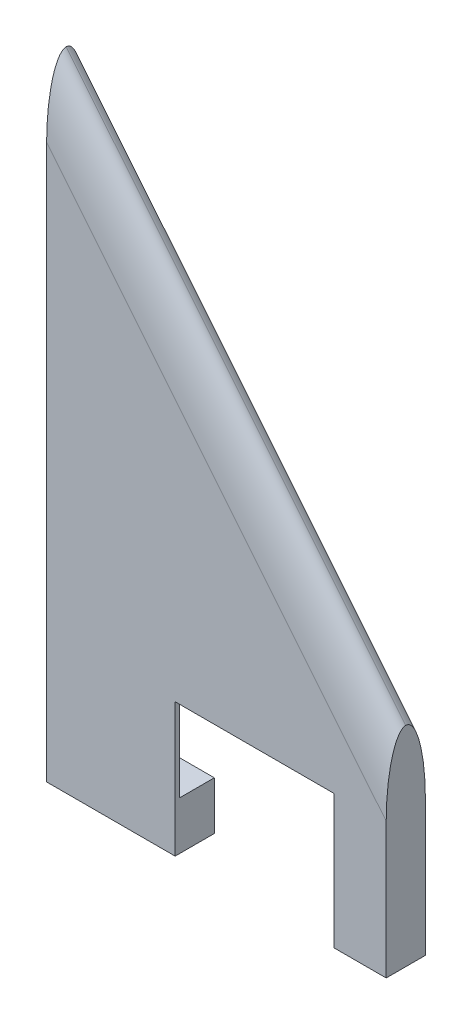
ISO-10303-21;
HEADER;
FILE_DESCRIPTION(('STEP AP214'),'2;1');
FILE_NAME('part.step','',(''),(''),'','','');
FILE_SCHEMA(('AUTOMOTIVE_DESIGN { 1 0 10303 214 1 1 1 1 }'));
ENDSEC;
DATA;
#1=APPLICATION_CONTEXT('core data for automotive mechanical design processes');
#2=APPLICATION_PROTOCOL_DEFINITION('international standard','automotive_design',2000,#1);
#3=PRODUCT_CONTEXT('',#1,'mechanical');
#4=PRODUCT('Part','Part','',(#3));
#5=PRODUCT_RELATED_PRODUCT_CATEGORY('part','',(#4));
#6=PRODUCT_DEFINITION_FORMATION('','',#4);
#7=PRODUCT_DEFINITION_CONTEXT('part definition',#1,'design');
#8=PRODUCT_DEFINITION('design','',#6,#7);
#9=PRODUCT_DEFINITION_SHAPE('','',#8);
#10=(LENGTH_UNIT() NAMED_UNIT(*) SI_UNIT(.MILLI.,.METRE.));
#11=(NAMED_UNIT(*) PLANE_ANGLE_UNIT() SI_UNIT($,.RADIAN.));
#12=(NAMED_UNIT(*) SI_UNIT($,.STERADIAN.) SOLID_ANGLE_UNIT());
#13=UNCERTAINTY_MEASURE_WITH_UNIT(LENGTH_MEASURE(1.E-05),#10,'distance_accuracy_value','');
#14=(GEOMETRIC_REPRESENTATION_CONTEXT(3) GLOBAL_UNCERTAINTY_ASSIGNED_CONTEXT((#13)) GLOBAL_UNIT_ASSIGNED_CONTEXT((#10,
#11,#12)) REPRESENTATION_CONTEXT('',''));
#15=CARTESIAN_POINT('',(0.,0.,0.));
#16=DIRECTION('',(0.,0.,1.));
#17=DIRECTION('',(1.,0.,0.));
#18=AXIS2_PLACEMENT_3D('',#15,#16,#17);
#19=CARTESIAN_POINT('',(0.,0.,-4.7625));
#20=DIRECTION('',(0.,0.,1.));
#21=DIRECTION('',(1.,0.,0.));
#22=AXIS2_PLACEMENT_3D('',#19,#20,#21);
#23=PLANE('',#22);
#24=DIRECTION('',(1.,0.,0.));
#25=VECTOR('',#24,1.);
#26=CARTESIAN_POINT('',(31.242,32.241499906,-4.7625));
#27=LINE('',#26,#25);
#28=CARTESIAN_POINT('',(17.0182560470692,32.241499906,-4.7625));
#29=VERTEX_POINT('',#28);
#30=CARTESIAN_POINT('',(31.242,32.241499906,-4.7625));
#31=VERTEX_POINT('',#30);
#32=EDGE_CURVE('E216',#29,#31,#27,.T.);
#33=ORIENTED_EDGE('',*,*,#32,.F.);
#34=CARTESIAN_POINT('',(17.0182560470692,35.416499906,-4.7625));
#35=DIRECTION('',(0.,0.,-1.));
#36=DIRECTION('',(-1.,0.,0.));
#37=AXIS2_PLACEMENT_3D('',#34,#35,#36);
#38=CIRCLE('',#37,3.175);
#39=CARTESIAN_POINT('',(14.7731920168019,33.1714358757327,-4.7625));
#40=VERTEX_POINT('',#39);
#41=EDGE_CURVE('E423',#29,#40,#38,.T.);
#42=ORIENTED_EDGE('',*,*,#41,.T.);
#43=DIRECTION('',(-0.707106781186546,0.707106781186549,0.));
#44=VECTOR('',#43,1.);
#45=CARTESIAN_POINT('',(14.7731920168019,33.1714358757327,-4.7625));
#46=LINE('',#45,#44);
#47=CARTESIAN_POINT('',(0.,47.9446278925346,-4.7625));
#48=VERTEX_POINT('',#47);
#49=EDGE_CURVE('E422',#40,#48,#46,.T.);
#50=ORIENTED_EDGE('',*,*,#49,.T.);
#51=DIRECTION('',(0.,-1.,0.));
#52=VECTOR('',#51,1.);
#53=CARTESIAN_POINT('',(0.,152.4,-4.7625));
#54=LINE('',#53,#52);
#55=CARTESIAN_POINT('',(0.,134.626096,-4.7625));
#56=VERTEX_POINT('',#55);
#57=EDGE_CURVE('E199',#56,#48,#54,.T.);
#58=ORIENTED_EDGE('',*,*,#57,.F.);
#59=CARTESIAN_POINT('',(84.143014050504,31.0654633224568,-4.7625));
#60=CARTESIAN_POINT('',(-1.59301405050503,136.586728677545,-4.7625));
#61=(BOUNDED_CURVE() B_SPLINE_CURVE(1,(#59,#60),.UNSPECIFIED.,.F.,
.F.) B_SPLINE_CURVE_WITH_KNOTS((2,2),(0.,1.),
.UNSPECIFIED.) CURVE() GEOMETRIC_REPRESENTATION_ITEM() RATIONAL_B_SPLINE_CURVE((1.,1.)) REPRESENTATION_ITEM(''));
#62=CARTESIAN_POINT('',(82.55,33.0260960000001,-4.7625));
#63=VERTEX_POINT('',#62);
#64=EDGE_CURVE('E334',#63,#56,#61,.T.);
#65=ORIENTED_EDGE('',*,*,#64,.F.);
#66=DIRECTION('',(0.,1.,0.));
#67=VECTOR('',#66,1.);
#68=CARTESIAN_POINT('',(82.55,0.,-4.7625));
#69=LINE('',#68,#67);
#70=CARTESIAN_POINT('',(82.55,0.,-4.7625));
#71=VERTEX_POINT('',#70);
#72=EDGE_CURVE('E368',#71,#63,#69,.T.);
#73=ORIENTED_EDGE('',*,*,#72,.F.);
#74=DIRECTION('',(1.,0.,0.));
#75=VECTOR('',#74,1.);
#76=CARTESIAN_POINT('',(0.,0.,-4.7625));
#77=LINE('',#76,#75);
#78=CARTESIAN_POINT('',(69.85,0.,-4.7625));
#79=VERTEX_POINT('',#78);
#80=EDGE_CURVE('E361',#79,#71,#77,.T.);
#81=ORIENTED_EDGE('',*,*,#80,.F.);
#82=DIRECTION('',(0.,1.,0.));
#83=VECTOR('',#82,1.);
#84=CARTESIAN_POINT('',(69.85,0.,-4.7625));
#85=LINE('',#84,#83);
#86=CARTESIAN_POINT('',(69.85,32.512,-4.7625));
#87=VERTEX_POINT('',#86);
#88=EDGE_CURVE('E70',#79,#87,#85,.T.);
#89=ORIENTED_EDGE('',*,*,#88,.T.);
#90=DIRECTION('',(-1.,0.,0.));
#91=VECTOR('',#90,1.);
#92=CARTESIAN_POINT('',(0.,32.512,-4.7625));
#93=LINE('',#92,#91);
#94=CARTESIAN_POINT('',(31.242,32.512,-4.7625));
#95=VERTEX_POINT('',#94);
#96=EDGE_CURVE('E259',#87,#95,#93,.T.);
#97=ORIENTED_EDGE('',*,*,#96,.T.);
#98=DIRECTION('',(0.,-1.,0.));
#99=VECTOR('',#98,1.);
#100=CARTESIAN_POINT('',(31.242,0.,-4.7625));
#101=LINE('',#100,#99);
#102=EDGE_CURVE('E258',#95,#31,#101,.T.);
#103=ORIENTED_EDGE('',*,*,#102,.T.);
#104=EDGE_LOOP('',(#33,#42,#50,#58,#65,#73,#81,#89,#97,#103));
#105=FACE_BOUND('',#104,.T.);
#106=ADVANCED_FACE('F45',(#105),#23,.F.);
#107=CARTESIAN_POINT('',(0.,0.,-4.7625));
#108=DIRECTION('',(0.,-1.,0.));
#109=DIRECTION('',(0.,0.,-1.));
#110=AXIS2_PLACEMENT_3D('',#107,#108,#109);
#111=PLANE('',#110);
#112=DIRECTION('',(0.,0.,-1.));
#113=VECTOR('',#112,1.);
#114=CARTESIAN_POINT('',(31.242,0.,-4.7625));
#115=LINE('',#114,#113);
#116=CARTESIAN_POINT('',(31.242,0.,4.7625));
#117=VERTEX_POINT('',#116);
#118=CARTESIAN_POINT('',(31.242,0.,-4.7625));
#119=VERTEX_POINT('',#118);
#120=EDGE_CURVE('E55',#117,#119,#115,.T.);
#121=ORIENTED_EDGE('',*,*,#120,.F.);
#122=DIRECTION('',(1.,0.,0.));
#123=VECTOR('',#122,1.);
#124=CARTESIAN_POINT('',(0.,0.,4.7625));
#125=LINE('',#124,#123);
#126=CARTESIAN_POINT('',(0.,0.,4.7625));
#127=VERTEX_POINT('',#126);
#128=EDGE_CURVE('E353',#127,#117,#125,.T.);
#129=ORIENTED_EDGE('',*,*,#128,.F.);
#130=DIRECTION('',(0.,0.,1.));
#131=VECTOR('',#130,1.);
#132=CARTESIAN_POINT('',(0.,0.,-4.7625));
#133=LINE('',#132,#131);
#134=CARTESIAN_POINT('',(0.,0.,-4.7625));
#135=VERTEX_POINT('',#134);
#136=EDGE_CURVE('E365',#135,#127,#133,.T.);
#137=ORIENTED_EDGE('',*,*,#136,.F.);
#138=EDGE_CURVE('E360',#135,#119,#77,.T.);
#139=ORIENTED_EDGE('',*,*,#138,.T.);
#140=EDGE_LOOP('',(#121,#129,#137,#139));
#141=FACE_BOUND('',#140,.T.);
#142=ADVANCED_FACE('F383',(#141),#111,.T.);
#143=CARTESIAN_POINT('',(0.,152.4,-4.7625));
#144=DIRECTION('',(-1.,0.,0.));
#145=DIRECTION('',(0.,-1.,0.));
#146=AXIS2_PLACEMENT_3D('',#143,#144,#145);
#147=PLANE('',#146);
#148=DIRECTION('',(0.,0.,1.));
#149=VECTOR('',#148,1.);
#150=CARTESIAN_POINT('',(0.,38.9643717714655,-4.7625));
#151=LINE('',#150,#149);
#152=CARTESIAN_POINT('',(0.,38.9643717714655,-4.7625));
#153=VERTEX_POINT('',#152);
#154=CARTESIAN_POINT('',(0.,38.9643717714654,3.753999985));
#155=VERTEX_POINT('',#154);
#156=EDGE_CURVE('E183',#153,#155,#151,.T.);
#157=ORIENTED_EDGE('',*,*,#156,.F.);
#158=EDGE_CURVE('E46',#153,#135,#54,.T.);
#159=ORIENTED_EDGE('',*,*,#158,.T.);
#160=ORIENTED_EDGE('',*,*,#136,.T.);
#161=DIRECTION('',(0.,-1.,0.));
#162=VECTOR('',#161,1.);
#163=CARTESIAN_POINT('',(0.,152.4,4.7625));
#164=LINE('',#163,#162);
#165=CARTESIAN_POINT('',(0.,134.626096,4.7625));
#166=VERTEX_POINT('',#165);
#167=EDGE_CURVE('E346',#166,#127,#164,.T.);
#168=ORIENTED_EDGE('',*,*,#167,.F.);
#169=CARTESIAN_POINT('',(0.,152.4,0.));
#170=CARTESIAN_POINT('',(0.,152.400035033636,0.0460353217043137));
#171=CARTESIAN_POINT('',(0.,152.397510348628,0.092048389848247));
#172=CARTESIAN_POINT('',(0.,152.387616574869,0.183456215200718));
#173=CARTESIAN_POINT('',(0.,152.380257716917,0.22885207200431));
#174=CARTESIAN_POINT('',(0.,152.361136052606,0.317870032808648));
#175=CARTESIAN_POINT('',(0.,152.349451962206,0.361509250159671));
#176=CARTESIAN_POINT('',(0.,152.322085738037,0.447528335791395));
#177=CARTESIAN_POINT('',(0.,152.30640143429,0.489907506563411));
#178=CARTESIAN_POINT('',(0.,152.267678441884,0.582292590972643));
#179=CARTESIAN_POINT('',(0.,152.243781467056,0.631938213996861));
#180=CARTESIAN_POINT('',(0.,152.191583767099,0.728835893407637));
#181=CARTESIAN_POINT('',(0.,152.163282003058,0.776087381621082));
#182=CARTESIAN_POINT('',(0.,152.072539822783,0.914832281977506));
#183=CARTESIAN_POINT('',(0.,152.004537830082,1.0027025118437));
#184=CARTESIAN_POINT('',(0.,151.865671174573,1.16156390178592));
#185=CARTESIAN_POINT('',(0.,151.79570046903,1.23336561679342));
#186=CARTESIAN_POINT('',(0.,151.649884699649,1.37082470305956));
#187=CARTESIAN_POINT('',(0.,151.574034462302,1.43647654815492));
#188=CARTESIAN_POINT('',(0.,151.417994237518,1.56251902023915));
#189=CARTESIAN_POINT('',(0.,151.337799606108,1.62290382962725));
#190=CARTESIAN_POINT('',(0.,151.174222677613,1.73908587819486));
#191=CARTESIAN_POINT('',(0.,151.090841638418,1.79488490083639));
#192=CARTESIAN_POINT('',(0.,150.916623207539,1.90571231906531));
#193=CARTESIAN_POINT('',(0.,150.825635461368,1.9605031242587));
#194=CARTESIAN_POINT('',(0.,150.641467893987,2.06628236222796));
#195=CARTESIAN_POINT('',(0.,150.548287661496,2.11727007399194));
#196=CARTESIAN_POINT('',(0.,150.265845275651,2.26543081603702));
#197=CARTESIAN_POINT('',(0.,150.073967478124,2.35762474998972));
#198=CARTESIAN_POINT('',(0.,149.685451589591,2.53166097585662));
#199=CARTESIAN_POINT('',(0.,149.488809350857,2.61349383161488));
#200=CARTESIAN_POINT('',(0.,149.091266225217,2.76902693224126));
#201=CARTESIAN_POINT('',(0.,148.890349437097,2.84268629146994));
#202=CARTESIAN_POINT('',(0.,148.486282253223,2.98274056381192));
#203=CARTESIAN_POINT('',(0.,148.283134748936,3.04914388365036));
#204=CARTESIAN_POINT('',(0.,147.875004215623,3.17579476160435));
#205=CARTESIAN_POINT('',(0.,147.670021728566,3.236044076066));
#206=CARTESIAN_POINT('',(0.,147.20654083781,3.36575403243569));
#207=CARTESIAN_POINT('',(0.,146.947617037235,3.43369143652455));
#208=CARTESIAN_POINT('',(0.,146.427968325099,3.56233638410223));
#209=CARTESIAN_POINT('',(0.,146.167243253727,3.62304327714451));
#210=CARTESIAN_POINT('',(0.,145.644266051838,3.73811570598632));
#211=CARTESIAN_POINT('',(0.,145.382013223683,3.79247805951878));
#212=CARTESIAN_POINT('',(0.,144.856384394493,3.89549144845027));
#213=CARTESIAN_POINT('',(0.,144.593008347617,3.94414224838209));
#214=CARTESIAN_POINT('',(0.,143.803327155152,4.08202499115886));
#215=CARTESIAN_POINT('',(0.,143.275671591928,4.16357407570671));
#216=CARTESIAN_POINT('',(0.,142.218108507689,4.30911377160106));
#217=CARTESIAN_POINT('',(0.,141.688201520497,4.37310833242561));
#218=CARTESIAN_POINT('',(0.,140.796109261285,4.46754886320363));
#219=CARTESIAN_POINT('',(0.,140.434359953462,4.50218402786367));
#220=CARTESIAN_POINT('',(0.,139.710251416084,4.56464139042936));
#221=CARTESIAN_POINT('',(0.,139.347892150851,4.59246317479112));
#222=CARTESIAN_POINT('',(0.,138.622716068646,4.64162063572102));
#223=CARTESIAN_POINT('',(0.,138.259899227307,4.66295595081763));
#224=CARTESIAN_POINT('',(0.,137.533768097491,4.69938247536571));
#225=CARTESIAN_POINT('',(0.,137.170453649834,4.71447050206478));
#226=CARTESIAN_POINT('',(0.,136.443649176497,4.73855030639753));
#227=CARTESIAN_POINT('',(0.,136.08015916492,4.74754251153926));
#228=CARTESIAN_POINT('',(0.,135.353144334243,4.75951121076306));
#229=CARTESIAN_POINT('',(0.,134.989619532732,4.76248877078858));
#230=CARTESIAN_POINT('',(0.,134.626096,4.7625));
#231=B_SPLINE_CURVE_WITH_KNOTS('',3,(#169,#170,#171,#172,#173,#174,#175,#176,#177,#178,#179,
#180,#181,#182,#183,#184,#185,#186,#187,#188,#189,#190,#191,#192,#193,#194,#195,#196,#197,#198,
#199,#200,#201,#202,#203,#204,#205,#206,#207,#208,#209,#210,#211,#212,#213,#214,#215,#216,#217,
#218,#219,#220,#221,#222,#223,#224,#225,#226,#227,#228,#229,#230),.UNSPECIFIED.,.F.,.F.,(4,2,2,
2,2,2,2,2,2,2,2,2,2,2,2,2,2,2,2,2,2,2,2,2,2,2,2,2,2,2,4),(0.,0.138001356637966,
0.275711591007032,0.411029825712227,0.546421622630146,0.711439441885342,0.876496241279847,
1.20860234299748,1.50898441203695,1.8096338605428,2.1106112879834,2.41147110260509,
2.72999502275467,3.04857917777845,3.68675363013516,4.32550516991869,4.96732011550648,
5.60838339954767,6.24926321062409,7.05220139522909,7.85521175654852,8.65862317297005,
9.46206769958628,11.0634453258416,12.6644623725191,13.7546109854224,14.8448257494314,
15.9351012567173,17.0259315358895,18.1166853057685,19.207245750213),.UNSPECIFIED.);
#232=CARTESIAN_POINT('',(0.,152.4,0.));
#233=VERTEX_POINT('',#232);
#234=EDGE_CURVE('E275',#233,#166,#231,.T.);
#235=ORIENTED_EDGE('',*,*,#234,.F.);
#236=CARTESIAN_POINT('',(0.,152.4,0.));
#237=CARTESIAN_POINT('',(0.,152.400035033636,-0.0460353217043137));
#238=CARTESIAN_POINT('',(0.,152.397510348628,-0.092048389848247));
#239=CARTESIAN_POINT('',(0.,152.387616574869,-0.183456215200718));
#240=CARTESIAN_POINT('',(0.,152.380257716917,-0.22885207200431));
#241=CARTESIAN_POINT('',(0.,152.361136052606,-0.317870032808648));
#242=CARTESIAN_POINT('',(0.,152.349451962206,-0.361509250159671));
#243=CARTESIAN_POINT('',(0.,152.322085738037,-0.447528335791395));
#244=CARTESIAN_POINT('',(0.,152.30640143429,-0.489907506563411));
#245=CARTESIAN_POINT('',(0.,152.267678441884,-0.582292590972643));
#246=CARTESIAN_POINT('',(0.,152.243781467056,-0.631938213996861));
#247=CARTESIAN_POINT('',(0.,152.191583767099,-0.728835893407637));
#248=CARTESIAN_POINT('',(0.,152.163282003058,-0.776087381621082));
#249=CARTESIAN_POINT('',(0.,152.072539822783,-0.914832281977506));
#250=CARTESIAN_POINT('',(0.,152.004537830082,-1.0027025118437));
#251=CARTESIAN_POINT('',(0.,151.865671174573,-1.16156390178592));
#252=CARTESIAN_POINT('',(0.,151.79570046903,-1.23336561679342));
#253=CARTESIAN_POINT('',(0.,151.649884699649,-1.37082470305956));
#254=CARTESIAN_POINT('',(0.,151.574034462302,-1.43647654815492));
#255=CARTESIAN_POINT('',(0.,151.417994237518,-1.56251902023915));
#256=CARTESIAN_POINT('',(0.,151.337799606108,-1.62290382962725));
#257=CARTESIAN_POINT('',(0.,151.174222677613,-1.73908587819486));
#258=CARTESIAN_POINT('',(0.,151.090841638418,-1.79488490083639));
#259=CARTESIAN_POINT('',(0.,150.916623207539,-1.90571231906531));
#260=CARTESIAN_POINT('',(0.,150.825635461368,-1.9605031242587));
#261=CARTESIAN_POINT('',(0.,150.641467893987,-2.06628236222796));
#262=CARTESIAN_POINT('',(0.,150.548287661496,-2.11727007399194));
#263=CARTESIAN_POINT('',(0.,150.265845275651,-2.26543081603702));
#264=CARTESIAN_POINT('',(0.,150.073967478124,-2.35762474998972));
#265=CARTESIAN_POINT('',(0.,149.685451589591,-2.53166097585662));
#266=CARTESIAN_POINT('',(0.,149.488809350857,-2.61349383161488));
#267=CARTESIAN_POINT('',(0.,149.091266225217,-2.76902693224126));
#268=CARTESIAN_POINT('',(0.,148.890349437097,-2.84268629146994));
#269=CARTESIAN_POINT('',(0.,148.486282253223,-2.98274056381192));
#270=CARTESIAN_POINT('',(0.,148.283134748936,-3.04914388365036));
#271=CARTESIAN_POINT('',(0.,147.875004215623,-3.17579476160435));
#272=CARTESIAN_POINT('',(0.,147.670021728566,-3.236044076066));
#273=CARTESIAN_POINT('',(0.,147.20654083781,-3.36575403243569));
#274=CARTESIAN_POINT('',(0.,146.947617037235,-3.43369143652455));
#275=CARTESIAN_POINT('',(0.,146.427968325099,-3.56233638410223));
#276=CARTESIAN_POINT('',(0.,146.167243253727,-3.62304327714451));
#277=CARTESIAN_POINT('',(0.,145.644266051838,-3.73811570598632));
#278=CARTESIAN_POINT('',(0.,145.382013223683,-3.79247805951878));
#279=CARTESIAN_POINT('',(0.,144.856384394493,-3.89549144845027));
#280=CARTESIAN_POINT('',(0.,144.593008347617,-3.94414224838209));
#281=CARTESIAN_POINT('',(0.,143.803327155152,-4.08202499115886));
#282=CARTESIAN_POINT('',(0.,143.275671591928,-4.16357407570671));
#283=CARTESIAN_POINT('',(0.,142.218108507689,-4.30911377160106));
#284=CARTESIAN_POINT('',(0.,141.688201520497,-4.37310833242561));
#285=CARTESIAN_POINT('',(0.,140.796109261285,-4.46754886320363));
#286=CARTESIAN_POINT('',(0.,140.434359953462,-4.50218402786367));
#287=CARTESIAN_POINT('',(0.,139.710251416084,-4.56464139042936));
#288=CARTESIAN_POINT('',(0.,139.347892150851,-4.59246317479112));
#289=CARTESIAN_POINT('',(0.,138.622716068646,-4.64162063572102));
#290=CARTESIAN_POINT('',(0.,138.259899227307,-4.66295595081763));
#291=CARTESIAN_POINT('',(0.,137.533768097491,-4.69938247536571));
#292=CARTESIAN_POINT('',(0.,137.170453649834,-4.71447050206478));
#293=CARTESIAN_POINT('',(0.,136.443649176497,-4.73855030639753));
#294=CARTESIAN_POINT('',(0.,136.08015916492,-4.74754251153926));
#295=CARTESIAN_POINT('',(0.,135.353144334243,-4.75951121076306));
#296=CARTESIAN_POINT('',(0.,134.989619532732,-4.76248877078858));
#297=CARTESIAN_POINT('',(0.,134.626096,-4.7625));
#298=B_SPLINE_CURVE_WITH_KNOTS('',3,(#236,#237,#238,#239,#240,#241,#242,#243,#244,#245,#246,
#247,#248,#249,#250,#251,#252,#253,#254,#255,#256,#257,#258,#259,#260,#261,#262,#263,#264,#265,
#266,#267,#268,#269,#270,#271,#272,#273,#274,#275,#276,#277,#278,#279,#280,#281,#282,#283,#284,
#285,#286,#287,#288,#289,#290,#291,#292,#293,#294,#295,#296,#297),.UNSPECIFIED.,.F.,.F.,(4,2,2,
2,2,2,2,2,2,2,2,2,2,2,2,2,2,2,2,2,2,2,2,2,2,2,2,2,2,2,4),(0.,0.138001356637966,
0.275711591007032,0.411029825712227,0.546421622630146,0.711439441885342,0.876496241279847,
1.20860234299748,1.50898441203695,1.8096338605428,2.1106112879834,2.41147110260509,
2.72999502275467,3.04857917777845,3.68675363013516,4.32550516991869,4.96732011550648,
5.60838339954767,6.24926321062409,7.05220139522909,7.85521175654852,8.65862317297005,
9.46206769958628,11.0634453258416,12.6644623725191,13.7546109854224,14.8448257494314,
15.9351012567173,17.0259315358895,18.1166853057685,19.207245750213),.UNSPECIFIED.);
#299=EDGE_CURVE('E265',#233,#56,#298,.T.);
#300=ORIENTED_EDGE('',*,*,#299,.T.);
#301=ORIENTED_EDGE('',*,*,#57,.T.);
#302=DIRECTION('',(0.,0.,-1.));
#303=VECTOR('',#302,1.);
#304=CARTESIAN_POINT('',(0.,47.9446278925346,3.753999985));
#305=LINE('',#304,#303);
#306=CARTESIAN_POINT('',(0.,47.9446278925346,3.753999985));
#307=VERTEX_POINT('',#306);
#308=EDGE_CURVE('E195',#307,#48,#305,.T.);
#309=ORIENTED_EDGE('',*,*,#308,.F.);
#310=DIRECTION('',(0.,-1.,0.));
#311=VECTOR('',#310,1.);
#312=CARTESIAN_POINT('',(0.,152.4,3.753999985));
#313=LINE('',#312,#311);
#314=EDGE_CURVE('E173',#307,#155,#313,.T.);
#315=ORIENTED_EDGE('',*,*,#314,.T.);
#316=EDGE_LOOP('',(#157,#159,#160,#168,#235,#300,#301,#309,#315));
#317=FACE_BOUND('',#316,.T.);
#318=ADVANCED_FACE('F42',(#317),#147,.T.);
#319=CARTESIAN_POINT('',(82.55,0.,-4.7625));
#320=DIRECTION('',(1.,0.,0.));
#321=DIRECTION('',(0.,0.,-1.));
#322=AXIS2_PLACEMENT_3D('',#319,#320,#321);
#323=PLANE('',#322);
#324=ORIENTED_EDGE('',*,*,#72,.T.);
#325=CARTESIAN_POINT('',(82.55,33.0260960000001,-4.7625));
#326=CARTESIAN_POINT('',(82.55,33.3956002438496,-4.76248798951415));
#327=CARTESIAN_POINT('',(82.55,33.7651059052485,-4.75941203124102));
#328=CARTESIAN_POINT('',(82.55,34.5040757855449,-4.74704583997439));
#329=CARTESIAN_POINT('',(82.55,34.873539986733,-4.73775455119044));
#330=CARTESIAN_POINT('',(82.55,35.6122811334555,-4.71287045374228));
#331=CARTESIAN_POINT('',(82.55,35.9815580651965,-4.69727723389376));
#332=CARTESIAN_POINT('',(82.55,36.7203900715193,-4.65958279205532));
#333=CARTESIAN_POINT('',(82.55,37.0899446042321,-4.63747090562335));
#334=CARTESIAN_POINT('',(82.55,37.8285710272719,-4.586496076904));
#335=CARTESIAN_POINT('',(82.55,38.1976429405719,-4.55763346866145));
#336=CARTESIAN_POINT('',(82.55,38.9351496556395,-4.49280576910793));
#337=CARTESIAN_POINT('',(82.55,39.3035844849044,-4.45684099246553));
#338=CARTESIAN_POINT('',(82.55,39.9910687862874,-4.38257970853919));
#339=CARTESIAN_POINT('',(82.55,40.3102191084172,-4.34521724685739));
#340=CARTESIAN_POINT('',(82.55,40.9477550317045,-4.26437619111586));
#341=CARTESIAN_POINT('',(82.55,41.2661406156573,-4.22089746074171));
#342=CARTESIAN_POINT('',(82.55,41.9019776251338,-4.12730209028201));
#343=CARTESIAN_POINT('',(82.55,42.2194289342284,-4.07718465594279));
#344=CARTESIAN_POINT('',(82.55,42.8533391374327,-3.96960716901609));
#345=CARTESIAN_POINT('',(82.55,43.1697970970377,-3.91214158021961));
#346=CARTESIAN_POINT('',(82.55,43.8010958152181,-3.7890253464074));
#347=CARTESIAN_POINT('',(82.55,44.1159367145863,-3.72337542700172));
#348=CARTESIAN_POINT('',(82.55,44.7434726953738,-3.58273227247705));
#349=CARTESIAN_POINT('',(82.55,45.0561682257681,-3.50774105935879));
#350=CARTESIAN_POINT('',(82.55,45.6155702761666,-3.36311295327358));
#351=CARTESIAN_POINT('',(82.55,45.8627926964346,-3.29547697569663));
#352=CARTESIAN_POINT('',(82.55,46.3549282726905,-3.15208976133382));
#353=CARTESIAN_POINT('',(82.55,46.5998411050839,-3.07633740522221));
#354=CARTESIAN_POINT('',(82.55,47.0856632641849,-2.91546443790836));
#355=CARTESIAN_POINT('',(82.55,47.3265834478838,-2.83037687803711));
#356=CARTESIAN_POINT('',(82.55,47.8039165551601,-2.64850004727122));
#357=CARTESIAN_POINT('',(82.55,48.040331212995,-2.55171538860134));
#358=CARTESIAN_POINT('',(82.55,48.4558015772737,-2.36588172394563));
#359=CARTESIAN_POINT('',(82.55,48.6361392537295,-2.27973606665569));
#360=CARTESIAN_POINT('',(82.55,48.902656846359,-2.14164754560901));
#361=CARTESIAN_POINT('',(82.55,48.9910632555877,-2.09399968238094));
#362=CARTESIAN_POINT('',(82.55,49.1660044640888,-1.99539392253665));
#363=CARTESIAN_POINT('',(82.55,49.2525394780149,-1.94443640825885));
#364=CARTESIAN_POINT('',(82.55,49.444702692406,-1.82546731913629));
#365=CARTESIAN_POINT('',(82.55,49.5496743916727,-1.75638453365344));
#366=CARTESIAN_POINT('',(82.55,49.7547315273864,-1.61100994324314));
#367=CARTESIAN_POINT('',(82.55,49.8548118181001,-1.53471078421293));
#368=CARTESIAN_POINT('',(82.55,50.0471180413079,-1.37400998137848));
#369=CARTESIAN_POINT('',(82.55,50.1393946597301,-1.28966966153316));
#370=CARTESIAN_POINT('',(82.55,50.3132930470085,-1.11071906409134));
#371=CARTESIAN_POINT('',(82.55,50.3949432220234,-1.01613745855839));
#372=CARTESIAN_POINT('',(82.55,50.4945940230189,-0.87982056517971));
#373=CARTESIAN_POINT('',(82.55,50.5197250451964,-0.84327307352495));
#374=CARTESIAN_POINT('',(82.55,50.5675607406152,-0.768632481304453));
#375=CARTESIAN_POINT('',(82.55,50.5902653783241,-0.730539358115425));
#376=CARTESIAN_POINT('',(82.55,50.6539817060609,-0.614199053341638));
#377=CARTESIAN_POINT('',(82.5500000000001,50.6908566989437,-0.533544832504867));
#378=CARTESIAN_POINT('',(82.55,50.7330772086918,-0.41447010880198));
#379=CARTESIAN_POINT('',(82.55,50.7444278133623,-0.378114677484978));
#380=CARTESIAN_POINT('',(82.55,50.7641417229697,-0.304600558961157));
#381=CARTESIAN_POINT('',(82.55,50.7725059265069,-0.267442116953144));
#382=CARTESIAN_POINT('',(82.55,50.7861005363587,-0.192087504755539));
#383=CARTESIAN_POINT('',(82.55,50.7912916848622,-0.153884213723158));
#384=CARTESIAN_POINT('',(82.55,50.7982521536344,-0.0771242498418477));
#385=CARTESIAN_POINT('',(82.55,50.8000175170233,-0.0385672199753601));
#386=CARTESIAN_POINT('',(82.55,50.8000000000001,0.));
#387=B_SPLINE_CURVE_WITH_KNOTS('',3,(#325,#326,#327,#328,#329,#330,#331,#332,#333,#334,#335,
#336,#337,#338,#339,#340,#341,#342,#343,#344,#345,#346,#347,#348,#349,#350,#351,#352,#353,#354,
#355,#356,#357,#358,#359,#360,#361,#362,#363,#364,#365,#366,#367,#368,#369,#370,#371,#372,#373,
#374,#375,#376,#377,#378,#379,#380,#381,#382,#383,#384,#385,#386),.UNSPECIFIED.,.F.,.F.,(4,2,2,
2,2,2,2,2,2,2,2,2,2,2,2,2,2,2,2,2,2,2,2,2,2,2,2,2,2,2,4),(0.,1.1085022241206,2.21719279596274,
3.32595571860861,4.43654272354886,5.54707478512079,6.65755765451089,7.62149370134102,
8.58545123499873,9.54952420075124,10.514327840948,11.4790460039007,12.4435557072756,
13.2123649325786,13.9812803207859,14.7475562298747,15.513530972305,16.112742841565,
16.4139712962092,16.7151650139385,17.0919224474069,17.4690680531344,17.84353797486,
18.2169853669019,18.3499628099053,18.4829421999921,18.7476104169223,18.8617713157103,
18.9758978347813,19.0914091931128,19.2070538911349),.UNSPECIFIED.);
#388=CARTESIAN_POINT('',(82.55,50.8000000000001,0.));
#389=VERTEX_POINT('',#388);
#390=EDGE_CURVE('E296',#63,#389,#387,.T.);
#391=ORIENTED_EDGE('',*,*,#390,.T.);
#392=CARTESIAN_POINT('',(82.55,33.0260960000001,4.7625));
#393=CARTESIAN_POINT('',(82.55,33.3956002438496,4.76248798951415));
#394=CARTESIAN_POINT('',(82.55,33.7651059052485,4.75941203124102));
#395=CARTESIAN_POINT('',(82.55,34.5040757855449,4.74704583997439));
#396=CARTESIAN_POINT('',(82.55,34.873539986733,4.73775455119044));
#397=CARTESIAN_POINT('',(82.55,35.6122811334555,4.71287045374228));
#398=CARTESIAN_POINT('',(82.55,35.9815580651965,4.69727723389376));
#399=CARTESIAN_POINT('',(82.55,36.7203900715193,4.65958279205532));
#400=CARTESIAN_POINT('',(82.55,37.0899446042321,4.63747090562335));
#401=CARTESIAN_POINT('',(82.55,37.8285710272719,4.586496076904));
#402=CARTESIAN_POINT('',(82.55,38.1976429405719,4.55763346866145));
#403=CARTESIAN_POINT('',(82.55,38.9351496556395,4.49280576910793));
#404=CARTESIAN_POINT('',(82.55,39.3035844849044,4.45684099246553));
#405=CARTESIAN_POINT('',(82.55,39.9910687862874,4.38257970853919));
#406=CARTESIAN_POINT('',(82.55,40.3102191084172,4.34521724685739));
#407=CARTESIAN_POINT('',(82.55,40.9477550317045,4.26437619111586));
#408=CARTESIAN_POINT('',(82.55,41.2661406156573,4.22089746074171));
#409=CARTESIAN_POINT('',(82.55,41.9019776251338,4.12730209028201));
#410=CARTESIAN_POINT('',(82.55,42.2194289342284,4.07718465594279));
#411=CARTESIAN_POINT('',(82.55,42.8533391374327,3.96960716901609));
#412=CARTESIAN_POINT('',(82.55,43.1697970970377,3.91214158021961));
#413=CARTESIAN_POINT('',(82.55,43.8010958152181,3.7890253464074));
#414=CARTESIAN_POINT('',(82.55,44.1159367145863,3.72337542700172));
#415=CARTESIAN_POINT('',(82.55,44.7434726953738,3.58273227247705));
#416=CARTESIAN_POINT('',(82.55,45.0561682257681,3.50774105935879));
#417=CARTESIAN_POINT('',(82.55,45.6155702761666,3.36311295327358));
#418=CARTESIAN_POINT('',(82.55,45.8627926964346,3.29547697569663));
#419=CARTESIAN_POINT('',(82.55,46.3549282726905,3.15208976133382));
#420=CARTESIAN_POINT('',(82.55,46.5998411050839,3.07633740522221));
#421=CARTESIAN_POINT('',(82.55,47.0856632641849,2.91546443790836));
#422=CARTESIAN_POINT('',(82.55,47.3265834478838,2.83037687803711));
#423=CARTESIAN_POINT('',(82.55,47.8039165551601,2.64850004727122));
#424=CARTESIAN_POINT('',(82.55,48.040331212995,2.55171538860134));
#425=CARTESIAN_POINT('',(82.55,48.4558015772737,2.36588172394563));
#426=CARTESIAN_POINT('',(82.55,48.6361392537295,2.27973606665569));
#427=CARTESIAN_POINT('',(82.55,48.902656846359,2.14164754560901));
#428=CARTESIAN_POINT('',(82.55,48.9910632555877,2.09399968238094));
#429=CARTESIAN_POINT('',(82.55,49.1660044640888,1.99539392253665));
#430=CARTESIAN_POINT('',(82.55,49.2525394780149,1.94443640825885));
#431=CARTESIAN_POINT('',(82.55,49.444702692406,1.82546731913629));
#432=CARTESIAN_POINT('',(82.55,49.5496743916727,1.75638453365344));
#433=CARTESIAN_POINT('',(82.55,49.7547315273864,1.61100994324314));
#434=CARTESIAN_POINT('',(82.55,49.8548118181001,1.53471078421293));
#435=CARTESIAN_POINT('',(82.55,50.0471180413079,1.37400998137848));
#436=CARTESIAN_POINT('',(82.55,50.1393946597301,1.28966966153316));
#437=CARTESIAN_POINT('',(82.55,50.3132930470085,1.11071906409134));
#438=CARTESIAN_POINT('',(82.55,50.3949432220234,1.01613745855839));
#439=CARTESIAN_POINT('',(82.55,50.4945940230189,0.87982056517971));
#440=CARTESIAN_POINT('',(82.55,50.5197250451964,0.84327307352495));
#441=CARTESIAN_POINT('',(82.55,50.5675607406152,0.768632481304453));
#442=CARTESIAN_POINT('',(82.55,50.5902653783241,0.730539358115425));
#443=CARTESIAN_POINT('',(82.55,50.6539817060609,0.614199053341638));
#444=CARTESIAN_POINT('',(82.5500000000001,50.6908566989437,0.533544832504867));
#445=CARTESIAN_POINT('',(82.55,50.7330772086918,0.41447010880198));
#446=CARTESIAN_POINT('',(82.55,50.7444278133623,0.378114677484978));
#447=CARTESIAN_POINT('',(82.55,50.7641417229697,0.304600558961157));
#448=CARTESIAN_POINT('',(82.55,50.7725059265069,0.267442116953144));
#449=CARTESIAN_POINT('',(82.55,50.7861005363587,0.192087504755539));
#450=CARTESIAN_POINT('',(82.55,50.7912916848622,0.153884213723158));
#451=CARTESIAN_POINT('',(82.55,50.7982521536344,0.0771242498418477));
#452=CARTESIAN_POINT('',(82.55,50.8000175170233,0.0385672199753601));
#453=CARTESIAN_POINT('',(82.55,50.8000000000001,0.));
#454=B_SPLINE_CURVE_WITH_KNOTS('',3,(#392,#393,#394,#395,#396,#397,#398,#399,#400,#401,#402,
#403,#404,#405,#406,#407,#408,#409,#410,#411,#412,#413,#414,#415,#416,#417,#418,#419,#420,#421,
#422,#423,#424,#425,#426,#427,#428,#429,#430,#431,#432,#433,#434,#435,#436,#437,#438,#439,#440,
#441,#442,#443,#444,#445,#446,#447,#448,#449,#450,#451,#452,#453),.UNSPECIFIED.,.F.,.F.,(4,2,2,
2,2,2,2,2,2,2,2,2,2,2,2,2,2,2,2,2,2,2,2,2,2,2,2,2,2,2,4),(0.,1.1085022241206,2.21719279596274,
3.32595571860861,4.43654272354886,5.54707478512079,6.65755765451089,7.62149370134102,
8.58545123499873,9.54952420075124,10.514327840948,11.4790460039007,12.4435557072756,
13.2123649325786,13.9812803207859,14.7475562298747,15.513530972305,16.112742841565,
16.4139712962092,16.7151650139385,17.0919224474069,17.4690680531344,17.84353797486,
18.2169853669019,18.3499628099053,18.4829421999921,18.7476104169223,18.8617713157103,
18.9758978347813,19.0914091931128,19.2070538911349),.UNSPECIFIED.);
#455=CARTESIAN_POINT('',(82.55,33.0260960000001,4.7625));
#456=VERTEX_POINT('',#455);
#457=EDGE_CURVE('E263',#456,#389,#454,.T.);
#458=ORIENTED_EDGE('',*,*,#457,.F.);
#459=DIRECTION('',(0.,1.,0.));
#460=VECTOR('',#459,1.);
#461=CARTESIAN_POINT('',(82.55,0.,4.7625));
#462=LINE('',#461,#460);
#463=CARTESIAN_POINT('',(82.55,0.,4.7625));
#464=VERTEX_POINT('',#463);
#465=EDGE_CURVE('E354',#464,#456,#462,.T.);
#466=ORIENTED_EDGE('',*,*,#465,.F.);
#467=DIRECTION('',(0.,0.,1.));
#468=VECTOR('',#467,1.);
#469=CARTESIAN_POINT('',(82.55,0.,-4.7625));
#470=LINE('',#469,#468);
#471=EDGE_CURVE('E369',#71,#464,#470,.T.);
#472=ORIENTED_EDGE('',*,*,#471,.F.);
#473=EDGE_LOOP('',(#324,#391,#458,#466,#472));
#474=FACE_BOUND('',#473,.T.);
#475=ADVANCED_FACE('F437',(#474),#323,.T.);
#476=ORIENTED_EDGE('',*,*,#158,.F.);
#477=DIRECTION('',(-0.707106781186546,0.707106781186549,0.));
#478=VECTOR('',#477,1.);
#479=CARTESIAN_POINT('',(10.2830639562673,28.6813078151981,-4.7625));
#480=LINE('',#479,#478);
#481=CARTESIAN_POINT('',(10.2830639562673,28.6813078151981,-4.7625));
#482=VERTEX_POINT('',#481);
#483=EDGE_CURVE('E419',#482,#153,#480,.T.);
#484=ORIENTED_EDGE('',*,*,#483,.F.);
#485=CARTESIAN_POINT('',(17.0182560470692,35.416499906,-4.7625));
#486=DIRECTION('',(0.,0.,-1.));
#487=DIRECTION('',(-1.,0.,0.));
#488=AXIS2_PLACEMENT_3D('',#485,#486,#487);
#489=CIRCLE('',#488,9.525);
#490=CARTESIAN_POINT('',(14.387999926,26.2618629531996,-4.7625));
#491=VERTEX_POINT('',#490);
#492=EDGE_CURVE('E416',#491,#482,#489,.T.);
#493=ORIENTED_EDGE('',*,*,#492,.F.);
#494=DIRECTION('',(0.,1.,0.));
#495=VECTOR('',#494,1.);
#496=CARTESIAN_POINT('',(14.387999926,29.066499906,-4.7625));
#497=LINE('',#496,#495);
#498=CARTESIAN_POINT('',(14.387999926,11.733500028,-4.7625));
#499=VERTEX_POINT('',#498);
#500=EDGE_CURVE('E235',#499,#491,#497,.T.);
#501=ORIENTED_EDGE('',*,*,#500,.F.);
#502=CARTESIAN_POINT('',(17.562999926,11.733500028,-4.7625));
#503=DIRECTION('',(0.,0.,-1.));
#504=DIRECTION('',(1.,0.,0.));
#505=AXIS2_PLACEMENT_3D('',#502,#503,#504);
#506=CIRCLE('',#505,3.175);
#507=CARTESIAN_POINT('',(20.737999926,11.733500028,-4.7625));
#508=VERTEX_POINT('',#507);
#509=EDGE_CURVE('E226',#508,#499,#506,.T.);
#510=ORIENTED_EDGE('',*,*,#509,.F.);
#511=DIRECTION('',(-1.,0.,0.));
#512=VECTOR('',#511,1.);
#513=CARTESIAN_POINT('',(31.242,11.733500028,-4.7625));
#514=LINE('',#513,#512);
#515=CARTESIAN_POINT('',(31.242,11.733500028,-4.7625));
#516=VERTEX_POINT('',#515);
#517=EDGE_CURVE('E215',#516,#508,#514,.T.);
#518=ORIENTED_EDGE('',*,*,#517,.F.);
#519=EDGE_CURVE('E254',#516,#119,#101,.T.);
#520=ORIENTED_EDGE('',*,*,#519,.T.);
#521=ORIENTED_EDGE('',*,*,#138,.F.);
#522=EDGE_LOOP('',(#476,#484,#493,#501,#510,#518,#520,#521));
#523=FACE_BOUND('',#522,.T.);
#524=ADVANCED_FACE('F398',(#523),#23,.F.);
#525=CARTESIAN_POINT('',(0.,0.,4.7625));
#526=DIRECTION('',(0.,0.,1.));
#527=DIRECTION('',(1.,0.,0.));
#528=AXIS2_PLACEMENT_3D('',#525,#526,#527);
#529=PLANE('',#528);
#530=DIRECTION('',(0.,-1.,0.));
#531=VECTOR('',#530,1.);
#532=CARTESIAN_POINT('',(31.242,0.,4.7625));
#533=LINE('',#532,#531);
#534=CARTESIAN_POINT('',(31.242,32.512,4.7625));
#535=VERTEX_POINT('',#534);
#536=EDGE_CURVE('E251',#535,#117,#533,.T.);
#537=ORIENTED_EDGE('',*,*,#536,.F.);
#538=DIRECTION('',(-1.,0.,0.));
#539=VECTOR('',#538,1.);
#540=CARTESIAN_POINT('',(0.,32.512,4.7625));
#541=LINE('',#540,#539);
#542=CARTESIAN_POINT('',(69.85,32.512,4.7625));
#543=VERTEX_POINT('',#542);
#544=EDGE_CURVE('E11',#543,#535,#541,.T.);
#545=ORIENTED_EDGE('',*,*,#544,.F.);
#546=DIRECTION('',(0.,1.,0.));
#547=VECTOR('',#546,1.);
#548=CARTESIAN_POINT('',(69.85,0.,4.7625));
#549=LINE('',#548,#547);
#550=CARTESIAN_POINT('',(69.85,0.,4.7625));
#551=VERTEX_POINT('',#550);
#552=EDGE_CURVE('E246',#551,#543,#549,.T.);
#553=ORIENTED_EDGE('',*,*,#552,.F.);
#554=EDGE_CURVE('E348',#551,#464,#125,.T.);
#555=ORIENTED_EDGE('',*,*,#554,.T.);
#556=ORIENTED_EDGE('',*,*,#465,.T.);
#557=DIRECTION('',(-0.630592625094466,0.776114000116265,0.));
#558=VECTOR('',#557,1.);
#559=CARTESIAN_POINT('',(84.143014050504,31.0654633224568,4.7625));
#560=LINE('',#559,#558);
#561=EDGE_CURVE('E339',#456,#166,#560,.T.);
#562=ORIENTED_EDGE('',*,*,#561,.T.);
#563=ORIENTED_EDGE('',*,*,#167,.T.);
#564=ORIENTED_EDGE('',*,*,#128,.T.);
#565=EDGE_LOOP('',(#537,#545,#553,#555,#556,#562,#563,#564));
#566=FACE_BOUND('',#565,.T.);
#567=ADVANCED_FACE('F390',(#566),#529,.T.);
#568=DIRECTION('',(0.,0.,1.));
#569=VECTOR('',#568,1.);
#570=CARTESIAN_POINT('',(69.85,0.,-4.7625));
#571=LINE('',#570,#569);
#572=EDGE_CURVE('E371',#79,#551,#571,.T.);
#573=ORIENTED_EDGE('',*,*,#572,.F.);
#574=ORIENTED_EDGE('',*,*,#80,.T.);
#575=ORIENTED_EDGE('',*,*,#471,.T.);
#576=ORIENTED_EDGE('',*,*,#554,.F.);
#577=EDGE_LOOP('',(#573,#574,#575,#576));
#578=FACE_BOUND('',#577,.T.);
#579=ADVANCED_FACE('F438',(#578),#111,.T.);
#580=CARTESIAN_POINT('',(84.143014050504,31.0654633224568,4.7625));
#581=CARTESIAN_POINT('',(-1.59301405050503,136.586728677545,4.7625));
#582=CARTESIAN_POINT('',(84.143014050504,41.4771752293394,4.7625));
#583=CARTESIAN_POINT('',(-1.59301405050504,146.998440584427,4.7625));
#584=CARTESIAN_POINT('',(84.143014050504,48.8393673224568,2.78980790919814));
#585=CARTESIAN_POINT('',(-1.59301405050504,154.360632677545,2.78980790919814));
#586=CARTESIAN_POINT('',(84.143014050504,48.8393673224568,0.));
#587=CARTESIAN_POINT('',(-1.59301405050503,154.360632677545,0.));
#588=(BOUNDED_SURFACE() B_SPLINE_SURFACE(3,1,((#580,#581),(#582,#583),(#584,#585),(#586,#587)),
.UNSPECIFIED.,.F.,.F.,.F.) B_SPLINE_SURFACE_WITH_KNOTS((4,4),(2,2),(0.,1.),(0.,1.),
.UNSPECIFIED.) GEOMETRIC_REPRESENTATION_ITEM() RATIONAL_B_SPLINE_SURFACE(((1.,1.),
(0.804737854124365,0.804737854124365),(0.804737854124365,0.804737854124365),(1.,1.))) REPRESENTATION_ITEM('') SURFACE());
#589=DIRECTION('',(-0.630592625094466,0.776114000116265,0.));
#590=VECTOR('',#589,1.);
#591=CARTESIAN_POINT('',(84.143014050504,48.8393673224568,0.));
#592=LINE('',#591,#590);
#593=EDGE_CURVE('E272',#389,#233,#592,.T.);
#594=ORIENTED_EDGE('',*,*,#234,.T.);
#595=ORIENTED_EDGE('',*,*,#561,.F.);
#596=ORIENTED_EDGE('',*,*,#457,.T.);
#597=ORIENTED_EDGE('',*,*,#593,.T.);
#598=EDGE_LOOP('',(#594,#595,#596,#597));
#599=FACE_BOUND('',#598,.T.);
#600=ADVANCED_FACE('F278',(#599),#588,.T.);
#601=CARTESIAN_POINT('',(84.143014050504,31.0654633224568,-4.7625));
#602=CARTESIAN_POINT('',(-1.59301405050503,136.586728677545,-4.7625));
#603=CARTESIAN_POINT('',(84.143014050504,41.4771752293394,-4.7625));
#604=CARTESIAN_POINT('',(-1.59301405050504,146.998440584427,-4.7625));
#605=CARTESIAN_POINT('',(84.143014050504,48.8393673224568,-2.78980790919814));
#606=CARTESIAN_POINT('',(-1.59301405050504,154.360632677545,-2.78980790919814));
#607=CARTESIAN_POINT('',(84.143014050504,48.8393673224568,0.));
#608=CARTESIAN_POINT('',(-1.59301405050503,154.360632677545,0.));
#609=(BOUNDED_SURFACE() B_SPLINE_SURFACE(3,1,((#601,#602),(#603,#604),(#605,#606),(#607,#608)),
.UNSPECIFIED.,.F.,.F.,.F.) B_SPLINE_SURFACE_WITH_KNOTS((4,4),(2,2),(0.,1.),(0.,1.),
.UNSPECIFIED.) GEOMETRIC_REPRESENTATION_ITEM() RATIONAL_B_SPLINE_SURFACE(((1.,1.),
(0.804737854124365,0.804737854124365),(0.804737854124365,0.804737854124365),(1.,1.))) REPRESENTATION_ITEM('') SURFACE());
#610=ORIENTED_EDGE('',*,*,#299,.F.);
#611=ORIENTED_EDGE('',*,*,#593,.F.);
#612=ORIENTED_EDGE('',*,*,#390,.F.);
#613=ORIENTED_EDGE('',*,*,#64,.T.);
#614=EDGE_LOOP('',(#610,#611,#612,#613));
#615=FACE_BOUND('',#614,.T.);
#616=ADVANCED_FACE('F303',(#615),#609,.F.);
#617=CARTESIAN_POINT('',(31.496,32.512,-5.44448258400657));
#618=DIRECTION('',(0.,1.,0.));
#619=DIRECTION('',(0.,0.,1.));
#620=AXIS2_PLACEMENT_3D('',#617,#618,#619);
#621=PLANE('',#620);
#622=DIRECTION('',(0.,0.,1.));
#623=VECTOR('',#622,1.);
#624=CARTESIAN_POINT('',(69.85,32.512,-5.44448258400657));
#625=LINE('',#624,#623);
#626=EDGE_CURVE('E239',#87,#543,#625,.T.);
#627=ORIENTED_EDGE('',*,*,#626,.T.);
#628=ORIENTED_EDGE('',*,*,#544,.T.);
#629=DIRECTION('',(0.,0.,1.));
#630=VECTOR('',#629,1.);
#631=CARTESIAN_POINT('',(31.242,32.512,-5.44448258400657));
#632=LINE('',#631,#630);
#633=EDGE_CURVE('E242',#95,#535,#632,.T.);
#634=ORIENTED_EDGE('',*,*,#633,.F.);
#635=ORIENTED_EDGE('',*,*,#96,.F.);
#636=EDGE_LOOP('',(#627,#628,#634,#635));
#637=FACE_BOUND('',#636,.T.);
#638=ADVANCED_FACE('F307',(#637),#621,.F.);
#639=CARTESIAN_POINT('',(31.242,32.512,-5.44448258400657));
#640=DIRECTION('',(-1.,0.,0.));
#641=DIRECTION('',(0.,-1.,0.));
#642=AXIS2_PLACEMENT_3D('',#639,#640,#641);
#643=PLANE('',#642);
#644=DIRECTION('',(0.,-1.,0.));
#645=VECTOR('',#644,1.);
#646=CARTESIAN_POINT('',(31.242,11.733500028,3.753999985));
#647=LINE('',#646,#645);
#648=CARTESIAN_POINT('',(31.242,32.241499906,3.753999985));
#649=VERTEX_POINT('',#648);
#650=CARTESIAN_POINT('',(31.242,11.733500028,3.753999985));
#651=VERTEX_POINT('',#650);
#652=EDGE_CURVE('E213',#649,#651,#647,.T.);
#653=ORIENTED_EDGE('',*,*,#652,.F.);
#654=DIRECTION('',(0.,0.,-1.));
#655=VECTOR('',#654,1.);
#656=CARTESIAN_POINT('',(31.242,32.241499906,3.753999985));
#657=LINE('',#656,#655);
#658=EDGE_CURVE('E237',#649,#31,#657,.T.);
#659=ORIENTED_EDGE('',*,*,#658,.T.);
#660=ORIENTED_EDGE('',*,*,#102,.F.);
#661=ORIENTED_EDGE('',*,*,#633,.T.);
#662=ORIENTED_EDGE('',*,*,#536,.T.);
#663=ORIENTED_EDGE('',*,*,#120,.T.);
#664=ORIENTED_EDGE('',*,*,#519,.F.);
#665=DIRECTION('',(0.,0.,-1.));
#666=VECTOR('',#665,1.);
#667=CARTESIAN_POINT('',(31.242,11.733500028,3.753999985));
#668=LINE('',#667,#666);
#669=EDGE_CURVE('E227',#651,#516,#668,.T.);
#670=ORIENTED_EDGE('',*,*,#669,.F.);
#671=EDGE_LOOP('',(#653,#659,#660,#661,#662,#663,#664,#670));
#672=FACE_BOUND('',#671,.T.);
#673=ADVANCED_FACE('F394',(#672),#643,.F.);
#674=CARTESIAN_POINT('',(69.85,32.512,-5.44448258400657));
#675=DIRECTION('',(1.,0.,0.));
#676=DIRECTION('',(0.,0.,-1.));
#677=AXIS2_PLACEMENT_3D('',#674,#675,#676);
#678=PLANE('',#677);
#679=ORIENTED_EDGE('',*,*,#572,.T.);
#680=ORIENTED_EDGE('',*,*,#552,.T.);
#681=ORIENTED_EDGE('',*,*,#626,.F.);
#682=ORIENTED_EDGE('',*,*,#88,.F.);
#683=EDGE_LOOP('',(#679,#680,#681,#682));
#684=FACE_BOUND('',#683,.T.);
#685=ADVANCED_FACE('F310',(#684),#678,.F.);
#686=CARTESIAN_POINT('',(31.242,32.241499906,3.753999985));
#687=DIRECTION('',(0.,1.,0.));
#688=DIRECTION('',(0.,0.,1.));
#689=AXIS2_PLACEMENT_3D('',#686,#687,#688);
#690=PLANE('',#689);
#691=ORIENTED_EDGE('',*,*,#32,.T.);
#692=ORIENTED_EDGE('',*,*,#658,.F.);
#693=DIRECTION('',(1.,0.,0.));
#694=VECTOR('',#693,1.);
#695=CARTESIAN_POINT('',(31.242,32.241499906,3.753999985));
#696=LINE('',#695,#694);
#697=CARTESIAN_POINT('',(17.0182560470692,32.241499906,3.753999985));
#698=VERTEX_POINT('',#697);
#699=EDGE_CURVE('E56',#698,#649,#696,.T.);
#700=ORIENTED_EDGE('',*,*,#699,.F.);
#701=DIRECTION('',(0.,0.,-1.));
#702=VECTOR('',#701,1.);
#703=CARTESIAN_POINT('',(17.0182560470692,32.241499906,3.753999985));
#704=LINE('',#703,#702);
#705=EDGE_CURVE('E201',#698,#29,#704,.T.);
#706=ORIENTED_EDGE('',*,*,#705,.T.);
#707=EDGE_LOOP('',(#691,#692,#700,#706));
#708=FACE_BOUND('',#707,.T.);
#709=ADVANCED_FACE('F433',(#708),#690,.F.);
#710=CARTESIAN_POINT('',(14.387999926,29.066499906,3.753999985));
#711=DIRECTION('',(-1.,0.,0.));
#712=DIRECTION('',(0.,0.,1.));
#713=AXIS2_PLACEMENT_3D('',#710,#711,#712);
#714=PLANE('',#713);
#715=ORIENTED_EDGE('',*,*,#500,.T.);
#716=DIRECTION('',(0.,0.,-1.));
#717=VECTOR('',#716,1.);
#718=CARTESIAN_POINT('',(14.387999926,26.2618629531996,3.753999985));
#719=LINE('',#718,#717);
#720=CARTESIAN_POINT('',(14.387999926,26.2618629531996,3.753999985));
#721=VERTEX_POINT('',#720);
#722=EDGE_CURVE('E188',#491,#721,#719,.F.);
#723=ORIENTED_EDGE('',*,*,#722,.T.);
#724=DIRECTION('',(0.,1.,0.));
#725=VECTOR('',#724,1.);
#726=CARTESIAN_POINT('',(14.387999926,29.066499906,3.753999985));
#727=LINE('',#726,#725);
#728=CARTESIAN_POINT('',(14.387999926,11.733500028,3.753999985));
#729=VERTEX_POINT('',#728);
#730=EDGE_CURVE('E225',#729,#721,#727,.T.);
#731=ORIENTED_EDGE('',*,*,#730,.F.);
#732=DIRECTION('',(0.,0.,-1.));
#733=VECTOR('',#732,1.);
#734=CARTESIAN_POINT('',(14.387999926,11.733500028,3.753999985));
#735=LINE('',#734,#733);
#736=EDGE_CURVE('E238',#729,#499,#735,.T.);
#737=ORIENTED_EDGE('',*,*,#736,.T.);
#738=EDGE_LOOP('',(#715,#723,#731,#737));
#739=FACE_BOUND('',#738,.T.);
#740=ADVANCED_FACE('F411',(#739),#714,.F.);
#741=CARTESIAN_POINT('',(17.562999926,11.733500028,3.753999985));
#742=DIRECTION('',(0.,0.,-1.));
#743=DIRECTION('',(-1.,0.,0.));
#744=AXIS2_PLACEMENT_3D('',#741,#742,#743);
#745=CYLINDRICAL_SURFACE('',#744,3.175);
#746=ORIENTED_EDGE('',*,*,#509,.T.);
#747=ORIENTED_EDGE('',*,*,#736,.F.);
#748=CARTESIAN_POINT('',(17.562999926,11.733500028,3.753999985));
#749=DIRECTION('',(0.,0.,-1.));
#750=DIRECTION('',(1.,0.,0.));
#751=AXIS2_PLACEMENT_3D('',#748,#749,#750);
#752=CIRCLE('',#751,3.175);
#753=CARTESIAN_POINT('',(20.737999926,11.733500028,3.753999985));
#754=VERTEX_POINT('',#753);
#755=EDGE_CURVE('E218',#754,#729,#752,.T.);
#756=ORIENTED_EDGE('',*,*,#755,.F.);
#757=DIRECTION('',(0.,0.,-1.));
#758=VECTOR('',#757,1.);
#759=CARTESIAN_POINT('',(20.737999926,11.733500028,3.753999985));
#760=LINE('',#759,#758);
#761=EDGE_CURVE('E245',#754,#508,#760,.T.);
#762=ORIENTED_EDGE('',*,*,#761,.T.);
#763=EDGE_LOOP('',(#746,#747,#756,#762));
#764=FACE_BOUND('',#763,.T.);
#765=ADVANCED_FACE('F407',(#764),#745,.F.);
#766=CARTESIAN_POINT('',(31.242,11.733500028,3.753999985));
#767=DIRECTION('',(0.,-1.,0.));
#768=DIRECTION('',(0.,0.,-1.));
#769=AXIS2_PLACEMENT_3D('',#766,#767,#768);
#770=PLANE('',#769);
#771=ORIENTED_EDGE('',*,*,#517,.T.);
#772=ORIENTED_EDGE('',*,*,#761,.F.);
#773=DIRECTION('',(-1.,0.,0.));
#774=VECTOR('',#773,1.);
#775=CARTESIAN_POINT('',(31.242,11.733500028,3.753999985));
#776=LINE('',#775,#774);
#777=EDGE_CURVE('E214',#651,#754,#776,.T.);
#778=ORIENTED_EDGE('',*,*,#777,.F.);
#779=ORIENTED_EDGE('',*,*,#669,.T.);
#780=EDGE_LOOP('',(#771,#772,#778,#779));
#781=FACE_BOUND('',#780,.T.);
#782=ADVANCED_FACE('F408',(#781),#770,.F.);
#783=CARTESIAN_POINT('',(17.562999926,29.066499906,3.753999985));
#784=DIRECTION('',(0.,0.,-1.));
#785=DIRECTION('',(-1.,0.,0.));
#786=AXIS2_PLACEMENT_3D('',#783,#784,#785);
#787=PLANE('',#786);
#788=CARTESIAN_POINT('',(17.0182560470692,35.416499906,3.753999985));
#789=DIRECTION('',(0.,0.,-1.));
#790=DIRECTION('',(-1.,0.,0.));
#791=AXIS2_PLACEMENT_3D('',#788,#789,#790);
#792=CIRCLE('',#791,3.175);
#793=CARTESIAN_POINT('',(14.7731920168019,33.1714358757327,3.753999985));
#794=VERTEX_POINT('',#793);
#795=EDGE_CURVE('E194',#698,#794,#792,.T.);
#796=ORIENTED_EDGE('',*,*,#795,.F.);
#797=ORIENTED_EDGE('',*,*,#699,.T.);
#798=ORIENTED_EDGE('',*,*,#652,.T.);
#799=ORIENTED_EDGE('',*,*,#777,.T.);
#800=ORIENTED_EDGE('',*,*,#755,.T.);
#801=ORIENTED_EDGE('',*,*,#730,.T.);
#802=CARTESIAN_POINT('',(17.0182560470692,35.416499906,3.753999985));
#803=DIRECTION('',(0.,0.,-1.));
#804=DIRECTION('',(-1.,0.,0.));
#805=AXIS2_PLACEMENT_3D('',#802,#803,#804);
#806=CIRCLE('',#805,9.525);
#807=CARTESIAN_POINT('',(10.2830639562673,28.6813078151981,3.753999985));
#808=VERTEX_POINT('',#807);
#809=EDGE_CURVE('E203',#721,#808,#806,.T.);
#810=ORIENTED_EDGE('',*,*,#809,.T.);
#811=DIRECTION('',(-0.707106781186544,0.707106781186551,0.));
#812=VECTOR('',#811,1.);
#813=CARTESIAN_POINT('',(-2.2450640302673,41.2094358017328,3.753999985));
#814=LINE('',#813,#812);
#815=EDGE_CURVE('E182',#808,#155,#814,.T.);
#816=ORIENTED_EDGE('',*,*,#815,.T.);
#817=ORIENTED_EDGE('',*,*,#314,.F.);
#818=DIRECTION('',(-0.707106781186544,0.707106781186551,0.));
#819=VECTOR('',#818,1.);
#820=CARTESIAN_POINT('',(2.2450640302673,45.6995638622673,3.753999985));
#821=LINE('',#820,#819);
#822=EDGE_CURVE('E179',#794,#307,#821,.T.);
#823=ORIENTED_EDGE('',*,*,#822,.F.);
#824=EDGE_LOOP('',(#796,#797,#798,#799,#800,#801,#810,#816,#817,#823));
#825=FACE_BOUND('',#824,.T.);
#826=ADVANCED_FACE('F180',(#825),#787,.T.);
#827=CARTESIAN_POINT('',(17.0182560470692,35.416499906,3.753999985));
#828=DIRECTION('',(0.,0.,-1.));
#829=DIRECTION('',(-1.,0.,0.));
#830=AXIS2_PLACEMENT_3D('',#827,#828,#829);
#831=CYLINDRICAL_SURFACE('',#830,9.525);
#832=ORIENTED_EDGE('',*,*,#492,.T.);
#833=DIRECTION('',(0.,0.,-1.));
#834=VECTOR('',#833,1.);
#835=CARTESIAN_POINT('',(10.2830639562673,28.6813078151981,3.753999985));
#836=LINE('',#835,#834);
#837=EDGE_CURVE('E207',#808,#482,#836,.T.);
#838=ORIENTED_EDGE('',*,*,#837,.F.);
#839=ORIENTED_EDGE('',*,*,#809,.F.);
#840=ORIENTED_EDGE('',*,*,#722,.F.);
#841=EDGE_LOOP('',(#832,#838,#839,#840));
#842=FACE_BOUND('',#841,.T.);
#843=ADVANCED_FACE('F418',(#842),#831,.F.);
#844=CARTESIAN_POINT('',(10.2830639562673,28.6813078151981,3.753999985));
#845=DIRECTION('',(-0.707106781186549,-0.707106781186546,0.));
#846=DIRECTION('',(0.707106781186546,-0.707106781186549,0.));
#847=AXIS2_PLACEMENT_3D('',#844,#845,#846);
#848=PLANE('',#847);
#849=ORIENTED_EDGE('',*,*,#156,.T.);
#850=ORIENTED_EDGE('',*,*,#815,.F.);
#851=ORIENTED_EDGE('',*,*,#837,.T.);
#852=ORIENTED_EDGE('',*,*,#483,.T.);
#853=EDGE_LOOP('',(#849,#850,#851,#852));
#854=FACE_BOUND('',#853,.T.);
#855=ADVANCED_FACE('F575',(#854),#848,.F.);
#856=CARTESIAN_POINT('',(17.0182560470692,35.416499906,3.753999985));
#857=DIRECTION('',(0.,0.,-1.));
#858=DIRECTION('',(-1.,0.,0.));
#859=AXIS2_PLACEMENT_3D('',#856,#857,#858);
#860=CYLINDRICAL_SURFACE('',#859,3.175);
#861=ORIENTED_EDGE('',*,*,#41,.F.);
#862=ORIENTED_EDGE('',*,*,#705,.F.);
#863=ORIENTED_EDGE('',*,*,#795,.T.);
#864=DIRECTION('',(0.,0.,-1.));
#865=VECTOR('',#864,1.);
#866=CARTESIAN_POINT('',(14.7731920168019,33.1714358757327,3.753999985));
#867=LINE('',#866,#865);
#868=EDGE_CURVE('E192',#794,#40,#867,.T.);
#869=ORIENTED_EDGE('',*,*,#868,.T.);
#870=EDGE_LOOP('',(#861,#862,#863,#869));
#871=FACE_BOUND('',#870,.T.);
#872=ADVANCED_FACE('F434',(#871),#860,.T.);
#873=CARTESIAN_POINT('',(14.7731920168019,33.1714358757327,3.753999985));
#874=DIRECTION('',(-0.707106781186549,-0.707106781186546,0.));
#875=DIRECTION('',(0.707106781186546,-0.707106781186549,0.));
#876=AXIS2_PLACEMENT_3D('',#873,#874,#875);
#877=PLANE('',#876);
#878=ORIENTED_EDGE('',*,*,#49,.F.);
#879=ORIENTED_EDGE('',*,*,#868,.F.);
#880=ORIENTED_EDGE('',*,*,#822,.T.);
#881=ORIENTED_EDGE('',*,*,#308,.T.);
#882=EDGE_LOOP('',(#878,#879,#880,#881));
#883=FACE_BOUND('',#882,.T.);
#884=ADVANCED_FACE('F193',(#883),#877,.T.);
#885=CLOSED_SHELL('',(#106,#142,#318,#475,#524,#567,#579,#600,#616,#638,#673,#685,#709,#740,
#765,#782,#826,#843,#855,#872,#884));
#886=MANIFOLD_SOLID_BREP('B2',#885);
#887=ADVANCED_BREP_SHAPE_REPRESENTATION('',(#18,#886),#14);
#888=SHAPE_DEFINITION_REPRESENTATION(#9,#887);
ENDSEC;
END-ISO-10303-21;
